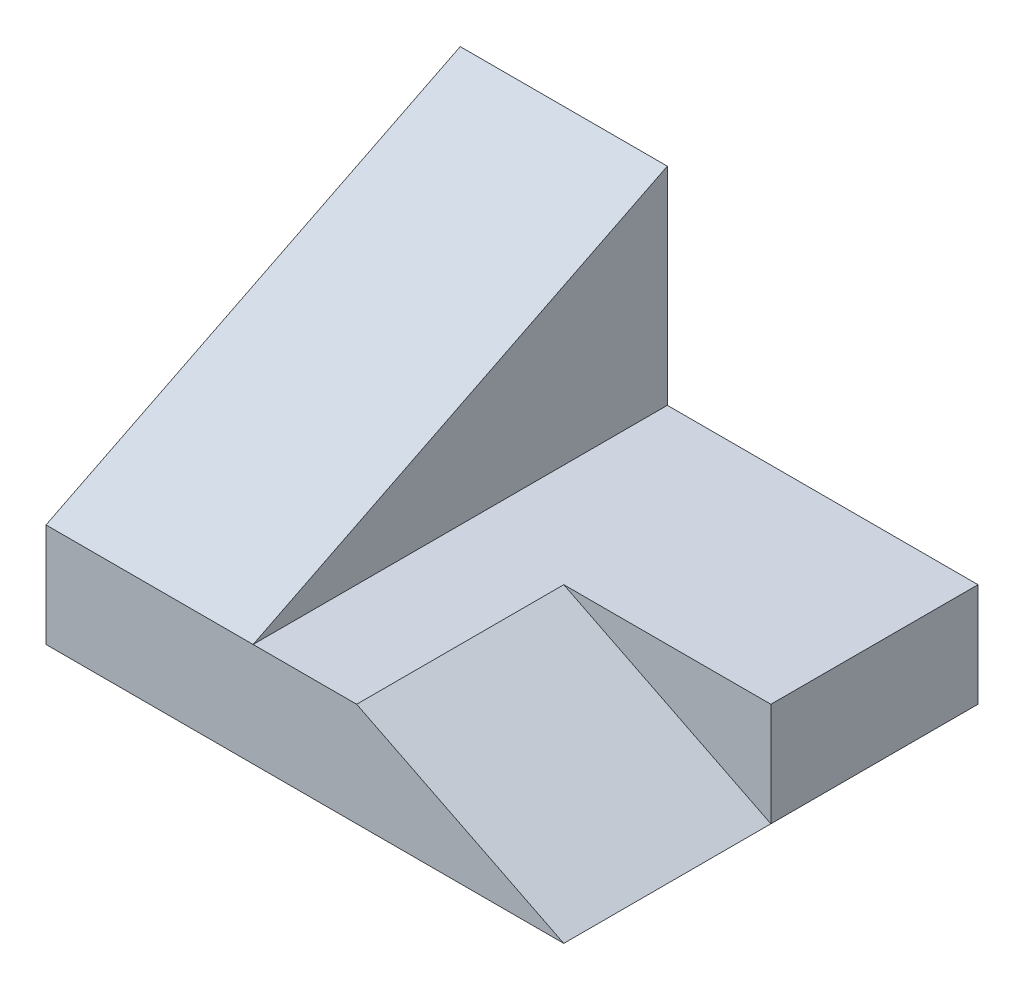
ISO-10303-21;
HEADER;
FILE_DESCRIPTION(('STEP AP214'),'2;1');
FILE_NAME('part.step','',(''),(''),'','','');
FILE_SCHEMA(('AUTOMOTIVE_DESIGN { 1 0 10303 214 1 1 1 1 }'));
ENDSEC;
DATA;
#1=APPLICATION_CONTEXT('core data for automotive mechanical design processes');
#2=APPLICATION_PROTOCOL_DEFINITION('international standard','automotive_design',2000,#1);
#3=PRODUCT_CONTEXT('',#1,'mechanical');
#4=PRODUCT('Part','Part','',(#3));
#5=PRODUCT_RELATED_PRODUCT_CATEGORY('part','',(#4));
#6=PRODUCT_DEFINITION_FORMATION('','',#4);
#7=PRODUCT_DEFINITION_CONTEXT('part definition',#1,'design');
#8=PRODUCT_DEFINITION('design','',#6,#7);
#9=PRODUCT_DEFINITION_SHAPE('','',#8);
#10=(LENGTH_UNIT() NAMED_UNIT(*) SI_UNIT(.MILLI.,.METRE.));
#11=(NAMED_UNIT(*) PLANE_ANGLE_UNIT() SI_UNIT($,.RADIAN.));
#12=(NAMED_UNIT(*) SI_UNIT($,.STERADIAN.) SOLID_ANGLE_UNIT());
#13=UNCERTAINTY_MEASURE_WITH_UNIT(LENGTH_MEASURE(1.E-05),#10,'distance_accuracy_value','');
#14=(GEOMETRIC_REPRESENTATION_CONTEXT(3) GLOBAL_UNCERTAINTY_ASSIGNED_CONTEXT((#13)) GLOBAL_UNIT_ASSIGNED_CONTEXT((#10,
#11,#12)) REPRESENTATION_CONTEXT('',''));
#15=CARTESIAN_POINT('',(0.,0.,0.));
#16=DIRECTION('',(0.,0.,1.));
#17=DIRECTION('',(1.,0.,0.));
#18=AXIS2_PLACEMENT_3D('',#15,#16,#17);
#19=CARTESIAN_POINT('',(-12.7,25.4,50.8));
#20=DIRECTION('',(0.,-1.,0.));
#21=DIRECTION('',(0.,0.,-1.));
#22=AXIS2_PLACEMENT_3D('',#19,#20,#21);
#23=PLANE('',#22);
#24=DIRECTION('',(0.,0.,1.));
#25=VECTOR('',#24,1.);
#26=CARTESIAN_POINT('',(-63.5,25.4,50.8));
#27=LINE('',#26,#25);
#28=CARTESIAN_POINT('',(-63.5,25.4,-50.8));
#29=VERTEX_POINT('',#28);
#30=CARTESIAN_POINT('',(-63.5,25.4,50.8));
#31=VERTEX_POINT('',#30);
#32=EDGE_CURVE('E101',#29,#31,#27,.T.);
#33=ORIENTED_EDGE('',*,*,#32,.F.);
#34=DIRECTION('',(-1.,0.,0.));
#35=VECTOR('',#34,1.);
#36=CARTESIAN_POINT('',(-12.7,25.4,-50.8));
#37=LINE('',#36,#35);
#38=CARTESIAN_POINT('',(-12.7,25.4,-50.8));
#39=VERTEX_POINT('',#38);
#40=EDGE_CURVE('E12',#39,#29,#37,.T.);
#41=ORIENTED_EDGE('',*,*,#40,.F.);
#42=DIRECTION('',(0.,0.,1.));
#43=VECTOR('',#42,1.);
#44=CARTESIAN_POINT('',(-12.7,25.4,50.8));
#45=LINE('',#44,#43);
#46=CARTESIAN_POINT('',(-12.7,25.4,50.8));
#47=VERTEX_POINT('',#46);
#48=EDGE_CURVE('E93',#39,#47,#45,.T.);
#49=ORIENTED_EDGE('',*,*,#48,.T.);
#50=DIRECTION('',(-1.,0.,0.));
#51=VECTOR('',#50,1.);
#52=CARTESIAN_POINT('',(-12.7,25.4,50.8));
#53=LINE('',#52,#51);
#54=EDGE_CURVE('E52',#47,#31,#53,.T.);
#55=ORIENTED_EDGE('',*,*,#54,.T.);
#56=EDGE_LOOP('',(#33,#41,#49,#55));
#57=FACE_BOUND('',#56,.T.);
#58=ADVANCED_FACE('F49',(#57),#23,.T.);
#59=CARTESIAN_POINT('',(-12.7,25.4,-50.8));
#60=DIRECTION('',(0.,0.,-1.));
#61=DIRECTION('',(-1.,0.,0.));
#62=AXIS2_PLACEMENT_3D('',#59,#60,#61);
#63=PLANE('',#62);
#64=DIRECTION('',(0.,-1.,0.));
#65=VECTOR('',#64,1.);
#66=CARTESIAN_POINT('',(-63.5,25.4,-50.8));
#67=LINE('',#66,#65);
#68=CARTESIAN_POINT('',(-63.5,76.2,-50.8));
#69=VERTEX_POINT('',#68);
#70=EDGE_CURVE('E95',#69,#29,#67,.T.);
#71=ORIENTED_EDGE('',*,*,#70,.F.);
#72=DIRECTION('',(-1.,0.,0.));
#73=VECTOR('',#72,1.);
#74=CARTESIAN_POINT('',(-12.7,76.2,-50.8));
#75=LINE('',#74,#73);
#76=CARTESIAN_POINT('',(-12.7,76.2,-50.8));
#77=VERTEX_POINT('',#76);
#78=EDGE_CURVE('E58',#77,#69,#75,.T.);
#79=ORIENTED_EDGE('',*,*,#78,.F.);
#80=DIRECTION('',(0.,-1.,0.));
#81=VECTOR('',#80,1.);
#82=CARTESIAN_POINT('',(-12.7,25.4,-50.8));
#83=LINE('',#82,#81);
#84=EDGE_CURVE('E90',#77,#39,#83,.T.);
#85=ORIENTED_EDGE('',*,*,#84,.T.);
#86=ORIENTED_EDGE('',*,*,#40,.T.);
#87=EDGE_LOOP('',(#71,#79,#85,#86));
#88=FACE_BOUND('',#87,.T.);
#89=ADVANCED_FACE('F105',(#88),#63,.T.);
#90=CARTESIAN_POINT('',(-12.7,76.2,-50.8));
#91=DIRECTION('',(0.,0.894427190999916,0.447213595499958));
#92=DIRECTION('',(0.,-0.447213595499958,0.894427190999916));
#93=AXIS2_PLACEMENT_3D('',#90,#91,#92);
#94=PLANE('',#93);
#95=DIRECTION('',(0.,0.447213595499958,-0.894427190999916));
#96=VECTOR('',#95,1.);
#97=CARTESIAN_POINT('',(-63.5,76.2,-50.8));
#98=LINE('',#97,#96);
#99=EDGE_CURVE('E88',#31,#69,#98,.T.);
#100=ORIENTED_EDGE('',*,*,#99,.F.);
#101=ORIENTED_EDGE('',*,*,#54,.F.);
#102=DIRECTION('',(0.,0.447213595499958,-0.894427190999916));
#103=VECTOR('',#102,1.);
#104=CARTESIAN_POINT('',(-12.7,76.2,-50.8));
#105=LINE('',#104,#103);
#106=EDGE_CURVE('E86',#47,#77,#105,.T.);
#107=ORIENTED_EDGE('',*,*,#106,.T.);
#108=ORIENTED_EDGE('',*,*,#78,.T.);
#109=EDGE_LOOP('',(#100,#101,#107,#108));
#110=FACE_BOUND('',#109,.T.);
#111=ADVANCED_FACE('F85',(#110),#94,.T.);
#112=CARTESIAN_POINT('',(-12.7,0.,0.));
#113=DIRECTION('',(1.,0.,0.));
#114=DIRECTION('',(0.,0.,-1.));
#115=AXIS2_PLACEMENT_3D('',#112,#113,#114);
#116=PLANE('',#115);
#117=ORIENTED_EDGE('',*,*,#48,.F.);
#118=ORIENTED_EDGE('',*,*,#84,.F.);
#119=ORIENTED_EDGE('',*,*,#106,.F.);
#120=EDGE_LOOP('',(#117,#118,#119));
#121=FACE_BOUND('',#120,.T.);
#122=ADVANCED_FACE('F92',(#121),#116,.T.);
#123=CARTESIAN_POINT('',(-63.5,0.,0.));
#124=DIRECTION('',(1.,0.,0.));
#125=DIRECTION('',(0.,0.,-1.));
#126=AXIS2_PLACEMENT_3D('',#123,#124,#125);
#127=PLANE('',#126);
#128=ORIENTED_EDGE('',*,*,#32,.T.);
#129=ORIENTED_EDGE('',*,*,#99,.T.);
#130=ORIENTED_EDGE('',*,*,#70,.T.);
#131=EDGE_LOOP('',(#128,#129,#130));
#132=FACE_BOUND('',#131,.T.);
#133=ADVANCED_FACE('F104',(#132),#127,.F.);
#134=CLOSED_SHELL('',(#58,#89,#111,#122,#133));
#135=MANIFOLD_SOLID_BREP('B2',#134);
#136=CARTESIAN_POINT('',(63.5,25.4,50.8));
#137=DIRECTION('',(-1.,0.,0.));
#138=DIRECTION('',(0.,0.,1.));
#139=AXIS2_PLACEMENT_3D('',#136,#137,#138);
#140=PLANE('',#139);
#141=DIRECTION('',(0.,1.,0.));
#142=VECTOR('',#141,1.);
#143=CARTESIAN_POINT('',(63.5,25.4,0.));
#144=LINE('',#143,#142);
#145=CARTESIAN_POINT('',(63.5,0.,0.));
#146=VERTEX_POINT('',#145);
#147=CARTESIAN_POINT('',(63.5,25.4,0.));
#148=VERTEX_POINT('',#147);
#149=EDGE_CURVE('E206',#146,#148,#144,.T.);
#150=ORIENTED_EDGE('',*,*,#149,.F.);
#151=DIRECTION('',(0.,0.,-1.));
#152=VECTOR('',#151,1.);
#153=CARTESIAN_POINT('',(63.5,0.,50.8));
#154=LINE('',#153,#152);
#155=CARTESIAN_POINT('',(63.5,0.,-50.8));
#156=VERTEX_POINT('',#155);
#157=EDGE_CURVE('E234',#146,#156,#154,.T.);
#158=ORIENTED_EDGE('',*,*,#157,.T.);
#159=DIRECTION('',(0.,-1.,0.));
#160=VECTOR('',#159,1.);
#161=CARTESIAN_POINT('',(63.5,25.4,-50.8));
#162=LINE('',#161,#160);
#163=CARTESIAN_POINT('',(63.5,25.4,-50.8));
#164=VERTEX_POINT('',#163);
#165=EDGE_CURVE('E47',#164,#156,#162,.T.);
#166=ORIENTED_EDGE('',*,*,#165,.F.);
#167=DIRECTION('',(0.,0.,-1.));
#168=VECTOR('',#167,1.);
#169=CARTESIAN_POINT('',(63.5,25.4,50.8));
#170=LINE('',#169,#168);
#171=EDGE_CURVE('E192',#148,#164,#170,.T.);
#172=ORIENTED_EDGE('',*,*,#171,.F.);
#173=EDGE_LOOP('',(#150,#158,#166,#172));
#174=FACE_BOUND('',#173,.T.);
#175=ADVANCED_FACE('F147',(#174),#140,.F.);
#176=CARTESIAN_POINT('',(-63.5,25.4,-50.8));
#177=DIRECTION('',(0.,0.,1.));
#178=DIRECTION('',(1.,0.,0.));
#179=AXIS2_PLACEMENT_3D('',#176,#177,#178);
#180=PLANE('',#179);
#181=DIRECTION('',(-1.,0.,0.));
#182=VECTOR('',#181,1.);
#183=CARTESIAN_POINT('',(-63.5,0.,-50.8));
#184=LINE('',#183,#182);
#185=CARTESIAN_POINT('',(-63.5,0.,-50.8));
#186=VERTEX_POINT('',#185);
#187=EDGE_CURVE('E233',#156,#186,#184,.T.);
#188=ORIENTED_EDGE('',*,*,#187,.T.);
#189=DIRECTION('',(0.,-1.,0.));
#190=VECTOR('',#189,1.);
#191=CARTESIAN_POINT('',(-63.5,25.4,-50.8));
#192=LINE('',#191,#190);
#193=CARTESIAN_POINT('',(-63.5,25.4,-50.8));
#194=VERTEX_POINT('',#193);
#195=EDGE_CURVE('E155',#194,#186,#192,.T.);
#196=ORIENTED_EDGE('',*,*,#195,.F.);
#197=DIRECTION('',(-1.,0.,0.));
#198=VECTOR('',#197,1.);
#199=CARTESIAN_POINT('',(-63.5,25.4,-50.8));
#200=LINE('',#199,#198);
#201=EDGE_CURVE('E219',#164,#194,#200,.T.);
#202=ORIENTED_EDGE('',*,*,#201,.F.);
#203=ORIENTED_EDGE('',*,*,#165,.T.);
#204=EDGE_LOOP('',(#188,#196,#202,#203));
#205=FACE_BOUND('',#204,.T.);
#206=ADVANCED_FACE('F260',(#205),#180,.F.);
#207=CARTESIAN_POINT('',(-63.5,25.4,50.8));
#208=DIRECTION('',(1.,0.,0.));
#209=DIRECTION('',(0.,0.,-1.));
#210=AXIS2_PLACEMENT_3D('',#207,#208,#209);
#211=PLANE('',#210);
#212=DIRECTION('',(0.,0.,1.));
#213=VECTOR('',#212,1.);
#214=CARTESIAN_POINT('',(-63.5,0.,50.8));
#215=LINE('',#214,#213);
#216=CARTESIAN_POINT('',(-63.5,0.,50.8));
#217=VERTEX_POINT('',#216);
#218=EDGE_CURVE('E180',#186,#217,#215,.T.);
#219=ORIENTED_EDGE('',*,*,#218,.T.);
#220=DIRECTION('',(0.,-1.,0.));
#221=VECTOR('',#220,1.);
#222=CARTESIAN_POINT('',(-63.5,25.4,50.8));
#223=LINE('',#222,#221);
#224=CARTESIAN_POINT('',(-63.5,25.4,50.8));
#225=VERTEX_POINT('',#224);
#226=EDGE_CURVE('E230',#225,#217,#223,.T.);
#227=ORIENTED_EDGE('',*,*,#226,.F.);
#228=DIRECTION('',(0.,0.,1.));
#229=VECTOR('',#228,1.);
#230=CARTESIAN_POINT('',(-63.5,25.4,50.8));
#231=LINE('',#230,#229);
#232=EDGE_CURVE('E163',#194,#225,#231,.T.);
#233=ORIENTED_EDGE('',*,*,#232,.F.);
#234=ORIENTED_EDGE('',*,*,#195,.T.);
#235=EDGE_LOOP('',(#219,#227,#233,#234));
#236=FACE_BOUND('',#235,.T.);
#237=ADVANCED_FACE('F238',(#236),#211,.F.);
#238=CARTESIAN_POINT('',(-63.5,25.4,50.8));
#239=DIRECTION('',(0.,0.,-1.));
#240=DIRECTION('',(-1.,0.,0.));
#241=AXIS2_PLACEMENT_3D('',#238,#239,#240);
#242=PLANE('',#241);
#243=DIRECTION('',(1.,0.,0.));
#244=VECTOR('',#243,1.);
#245=CARTESIAN_POINT('',(-63.5,0.,50.8));
#246=LINE('',#245,#244);
#247=CARTESIAN_POINT('',(63.5,0.,50.8));
#248=VERTEX_POINT('',#247);
#249=EDGE_CURVE('E220',#217,#248,#246,.T.);
#250=ORIENTED_EDGE('',*,*,#249,.T.);
#251=DIRECTION('',(0.894427190999916,-0.447213595499958,0.));
#252=VECTOR('',#251,1.);
#253=CARTESIAN_POINT('',(63.5,0.,50.8));
#254=LINE('',#253,#252);
#255=CARTESIAN_POINT('',(12.7,25.4,50.8));
#256=VERTEX_POINT('',#255);
#257=EDGE_CURVE('E187',#256,#248,#254,.T.);
#258=ORIENTED_EDGE('',*,*,#257,.F.);
#259=DIRECTION('',(1.,0.,0.));
#260=VECTOR('',#259,1.);
#261=CARTESIAN_POINT('',(-63.5,25.4,50.8));
#262=LINE('',#261,#260);
#263=EDGE_CURVE('E228',#225,#256,#262,.T.);
#264=ORIENTED_EDGE('',*,*,#263,.F.);
#265=ORIENTED_EDGE('',*,*,#226,.T.);
#266=EDGE_LOOP('',(#250,#258,#264,#265));
#267=FACE_BOUND('',#266,.T.);
#268=ADVANCED_FACE('F246',(#267),#242,.F.);
#269=CARTESIAN_POINT('',(0.,25.4,0.));
#270=DIRECTION('',(0.,-1.,0.));
#271=DIRECTION('',(0.,0.,-1.));
#272=AXIS2_PLACEMENT_3D('',#269,#270,#271);
#273=PLANE('',#272);
#274=ORIENTED_EDGE('',*,*,#263,.T.);
#275=DIRECTION('',(0.,0.,1.));
#276=VECTOR('',#275,1.);
#277=CARTESIAN_POINT('',(12.7,25.4,0.));
#278=LINE('',#277,#276);
#279=CARTESIAN_POINT('',(12.7,25.4,0.));
#280=VERTEX_POINT('',#279);
#281=EDGE_CURVE('E216',#280,#256,#278,.T.);
#282=ORIENTED_EDGE('',*,*,#281,.F.);
#283=DIRECTION('',(-1.,0.,0.));
#284=VECTOR('',#283,1.);
#285=CARTESIAN_POINT('',(12.7,25.4,0.));
#286=LINE('',#285,#284);
#287=EDGE_CURVE('E208',#148,#280,#286,.T.);
#288=ORIENTED_EDGE('',*,*,#287,.F.);
#289=ORIENTED_EDGE('',*,*,#171,.T.);
#290=ORIENTED_EDGE('',*,*,#201,.T.);
#291=ORIENTED_EDGE('',*,*,#232,.T.);
#292=EDGE_LOOP('',(#274,#282,#288,#289,#290,#291));
#293=FACE_BOUND('',#292,.T.);
#294=ADVANCED_FACE('F215',(#293),#273,.F.);
#295=CARTESIAN_POINT('',(0.,0.,0.));
#296=DIRECTION('',(0.,-1.,0.));
#297=DIRECTION('',(0.,0.,-1.));
#298=AXIS2_PLACEMENT_3D('',#295,#296,#297);
#299=PLANE('',#298);
#300=EDGE_CURVE('E231',#248,#146,#154,.T.);
#301=ORIENTED_EDGE('',*,*,#300,.F.);
#302=ORIENTED_EDGE('',*,*,#249,.F.);
#303=ORIENTED_EDGE('',*,*,#218,.F.);
#304=ORIENTED_EDGE('',*,*,#187,.F.);
#305=ORIENTED_EDGE('',*,*,#157,.F.);
#306=EDGE_LOOP('',(#301,#302,#303,#304,#305));
#307=FACE_BOUND('',#306,.T.);
#308=ADVANCED_FACE('F244',(#307),#299,.T.);
#309=CARTESIAN_POINT('',(63.5,0.,0.));
#310=DIRECTION('',(-0.447213595499958,-0.894427190999916,0.));
#311=DIRECTION('',(0.894427190999916,-0.447213595499958,0.));
#312=AXIS2_PLACEMENT_3D('',#309,#310,#311);
#313=PLANE('',#312);
#314=ORIENTED_EDGE('',*,*,#257,.T.);
#315=ORIENTED_EDGE('',*,*,#300,.T.);
#316=DIRECTION('',(0.894427190999916,-0.447213595499958,0.));
#317=VECTOR('',#316,1.);
#318=CARTESIAN_POINT('',(63.5,0.,0.));
#319=LINE('',#318,#317);
#320=EDGE_CURVE('E210',#280,#146,#319,.T.);
#321=ORIENTED_EDGE('',*,*,#320,.F.);
#322=ORIENTED_EDGE('',*,*,#281,.T.);
#323=EDGE_LOOP('',(#314,#315,#321,#322));
#324=FACE_BOUND('',#323,.T.);
#325=ADVANCED_FACE('F249',(#324),#313,.F.);
#326=CARTESIAN_POINT('',(0.,0.,0.));
#327=DIRECTION('',(0.,0.,1.));
#328=DIRECTION('',(1.,0.,0.));
#329=AXIS2_PLACEMENT_3D('',#326,#327,#328);
#330=PLANE('',#329);
#331=ORIENTED_EDGE('',*,*,#149,.T.);
#332=ORIENTED_EDGE('',*,*,#287,.T.);
#333=ORIENTED_EDGE('',*,*,#320,.T.);
#334=EDGE_LOOP('',(#331,#332,#333));
#335=FACE_BOUND('',#334,.T.);
#336=ADVANCED_FACE('F207',(#335),#330,.T.);
#337=CLOSED_SHELL('',(#175,#206,#237,#268,#294,#308,#325,#336));
#338=MANIFOLD_SOLID_BREP('B6',#337);
#339=ADVANCED_BREP_SHAPE_REPRESENTATION('',(#18,#135,#338),#14);
#340=SHAPE_DEFINITION_REPRESENTATION(#9,#339);
ENDSEC;
END-ISO-10303-21;
